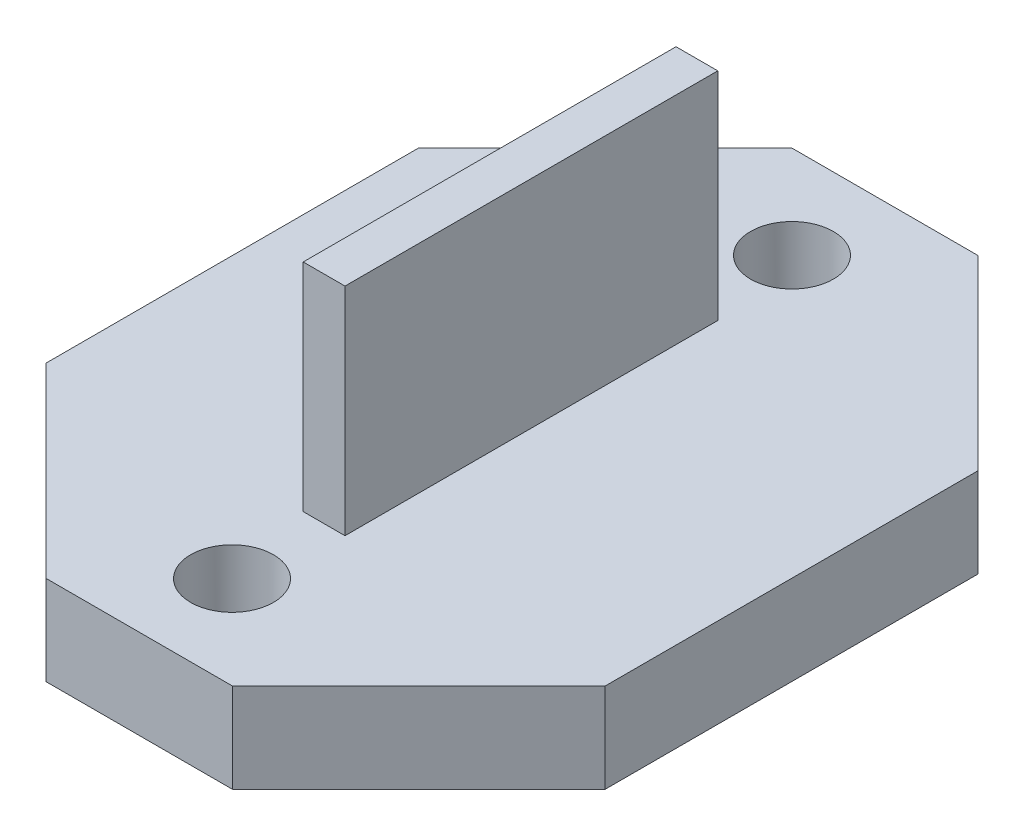
ISO-10303-21;
HEADER;
FILE_DESCRIPTION(('STEP AP214'),'2;1');
FILE_NAME('part.step','',(''),(''),'','','');
FILE_SCHEMA(('AUTOMOTIVE_DESIGN { 1 0 10303 214 1 1 1 1 }'));
ENDSEC;
DATA;
#1=APPLICATION_CONTEXT('core data for automotive mechanical design processes');
#2=APPLICATION_PROTOCOL_DEFINITION('international standard','automotive_design',2000,#1);
#3=PRODUCT_CONTEXT('',#1,'mechanical');
#4=PRODUCT('Part','Part','',(#3));
#5=PRODUCT_RELATED_PRODUCT_CATEGORY('part','',(#4));
#6=PRODUCT_DEFINITION_FORMATION('','',#4);
#7=PRODUCT_DEFINITION_CONTEXT('part definition',#1,'design');
#8=PRODUCT_DEFINITION('design','',#6,#7);
#9=PRODUCT_DEFINITION_SHAPE('','',#8);
#10=(LENGTH_UNIT() NAMED_UNIT(*) SI_UNIT(.MILLI.,.METRE.));
#11=(NAMED_UNIT(*) PLANE_ANGLE_UNIT() SI_UNIT($,.RADIAN.));
#12=(NAMED_UNIT(*) SI_UNIT($,.STERADIAN.) SOLID_ANGLE_UNIT());
#13=UNCERTAINTY_MEASURE_WITH_UNIT(LENGTH_MEASURE(1.E-05),#10,'distance_accuracy_value','');
#14=(GEOMETRIC_REPRESENTATION_CONTEXT(3) GLOBAL_UNCERTAINTY_ASSIGNED_CONTEXT((#13)) GLOBAL_UNIT_ASSIGNED_CONTEXT((#10,
#11,#12)) REPRESENTATION_CONTEXT('',''));
#15=CARTESIAN_POINT('',(0.,0.,0.));
#16=DIRECTION('',(0.,0.,1.));
#17=DIRECTION('',(1.,0.,0.));
#18=AXIS2_PLACEMENT_3D('',#15,#16,#17);
#19=CARTESIAN_POINT('',(0.,3.048,0.));
#20=DIRECTION('',(0.,-1.,0.));
#21=DIRECTION('',(0.,0.,-1.));
#22=AXIS2_PLACEMENT_3D('',#19,#20,#21);
#23=PLANE('',#22);
#24=DIRECTION('',(0.,0.,1.));
#25=VECTOR('',#24,1.);
#26=CARTESIAN_POINT('',(0.,3.048,12.7));
#27=LINE('',#26,#25);
#28=CARTESIAN_POINT('',(0.,3.048,0.));
#29=VERTEX_POINT('',#28);
#30=CARTESIAN_POINT('',(0.,3.048,12.7));
#31=VERTEX_POINT('',#30);
#32=EDGE_CURVE('E145',#29,#31,#27,.T.);
#33=ORIENTED_EDGE('',*,*,#32,.T.);
#34=DIRECTION('',(0.707106810614209,0.,0.707106751758885));
#35=VECTOR('',#34,1.);
#36=CARTESIAN_POINT('',(6.35,3.048,19.0499994714641));
#37=LINE('',#36,#35);
#38=CARTESIAN_POINT('',(6.35,3.048,19.0499994714641));
#39=VERTEX_POINT('',#38);
#40=EDGE_CURVE('E148',#31,#39,#37,.T.);
#41=ORIENTED_EDGE('',*,*,#40,.T.);
#42=DIRECTION('',(1.,0.,0.));
#43=VECTOR('',#42,1.);
#44=CARTESIAN_POINT('',(12.7,3.048,19.0499994714641));
#45=LINE('',#44,#43);
#46=CARTESIAN_POINT('',(12.7,3.048,19.0499994714641));
#47=VERTEX_POINT('',#46);
#48=EDGE_CURVE('E151',#39,#47,#45,.T.);
#49=ORIENTED_EDGE('',*,*,#48,.T.);
#50=DIRECTION('',(0.707106751758886,0.,-0.707106810614208));
#51=VECTOR('',#50,1.);
#52=CARTESIAN_POINT('',(19.05,3.048,12.6999989429282));
#53=LINE('',#52,#51);
#54=CARTESIAN_POINT('',(19.05,3.048,12.6999989429282));
#55=VERTEX_POINT('',#54);
#56=EDGE_CURVE('E153',#47,#55,#53,.T.);
#57=ORIENTED_EDGE('',*,*,#56,.T.);
#58=DIRECTION('',(0.,0.,-1.));
#59=VECTOR('',#58,1.);
#60=CARTESIAN_POINT('',(19.05,3.048,-1.05707180855785E-06));
#61=LINE('',#60,#59);
#62=CARTESIAN_POINT('',(19.05,3.048,-1.05707180855785E-06));
#63=VERTEX_POINT('',#62);
#64=EDGE_CURVE('E155',#55,#63,#61,.T.);
#65=ORIENTED_EDGE('',*,*,#64,.T.);
#66=DIRECTION('',(-0.707106810614211,0.,-0.707106751758883));
#67=VECTOR('',#66,1.);
#68=CARTESIAN_POINT('',(12.7,3.048,-6.35000052853592));
#69=LINE('',#68,#67);
#70=CARTESIAN_POINT('',(12.7,3.048,-6.35000052853592));
#71=VERTEX_POINT('',#70);
#72=EDGE_CURVE('E157',#63,#71,#69,.T.);
#73=ORIENTED_EDGE('',*,*,#72,.T.);
#74=DIRECTION('',(-1.,0.,0.));
#75=VECTOR('',#74,1.);
#76=CARTESIAN_POINT('',(6.35,3.048,-6.35000052853592));
#77=LINE('',#76,#75);
#78=CARTESIAN_POINT('',(6.35,3.048,-6.35000052853592));
#79=VERTEX_POINT('',#78);
#80=EDGE_CURVE('E159',#71,#79,#77,.T.);
#81=ORIENTED_EDGE('',*,*,#80,.T.);
#82=DIRECTION('',(-0.707106751758885,0.,0.707106810614209));
#83=VECTOR('',#82,1.);
#84=CARTESIAN_POINT('',(0.,3.048,0.));
#85=LINE('',#84,#83);
#86=EDGE_CURVE('E161',#79,#29,#85,.T.);
#87=ORIENTED_EDGE('',*,*,#86,.T.);
#88=EDGE_LOOP('',(#33,#41,#49,#57,#65,#73,#81,#87));
#89=FACE_BOUND('',#88,.T.);
#90=CARTESIAN_POINT('',(9.525,3.048,15.8876994714641));
#91=DIRECTION('',(0.,-1.,0.));
#92=DIRECTION('',(0.,0.,-1.));
#93=AXIS2_PLACEMENT_3D('',#90,#91,#92);
#94=CIRCLE('',#93,1.4097);
#95=CARTESIAN_POINT('',(9.525,3.048,14.4779994714641));
#96=VERTEX_POINT('',#95);
#97=EDGE_CURVE('E137',#96,#96,#94,.T.);
#98=ORIENTED_EDGE('',*,*,#97,.T.);
#99=EDGE_LOOP('',(#98));
#100=FACE_BOUND('',#99,.T.);
#101=CARTESIAN_POINT('',(9.525,3.048,-3.18770052853592));
#102=DIRECTION('',(0.,-1.,0.));
#103=DIRECTION('',(0.,0.,-1.));
#104=AXIS2_PLACEMENT_3D('',#101,#102,#103);
#105=CIRCLE('',#104,1.4097);
#106=CARTESIAN_POINT('',(9.525,3.048,-4.59740052853592));
#107=VERTEX_POINT('',#106);
#108=EDGE_CURVE('E141',#107,#107,#105,.T.);
#109=ORIENTED_EDGE('',*,*,#108,.T.);
#110=EDGE_LOOP('',(#109));
#111=FACE_BOUND('',#110,.T.);
#112=DIRECTION('',(0.,0.,1.));
#113=VECTOR('',#112,1.);
#114=CARTESIAN_POINT('',(8.763,3.048,-5.28535918156714E-07));
#115=LINE('',#114,#113);
#116=CARTESIAN_POINT('',(8.763,3.048,-5.28535918156714E-07));
#117=VERTEX_POINT('',#116);
#118=CARTESIAN_POINT('',(8.763,3.048,12.6999994714641));
#119=VERTEX_POINT('',#118);
#120=EDGE_CURVE('E126',#117,#119,#115,.T.);
#121=ORIENTED_EDGE('',*,*,#120,.F.);
#122=DIRECTION('',(-1.,0.,0.));
#123=VECTOR('',#122,1.);
#124=CARTESIAN_POINT('',(8.763,3.048,-5.28535918156714E-07));
#125=LINE('',#124,#123);
#126=CARTESIAN_POINT('',(10.1854,3.048,-5.28535918156714E-07));
#127=VERTEX_POINT('',#126);
#128=EDGE_CURVE('E123',#127,#117,#125,.T.);
#129=ORIENTED_EDGE('',*,*,#128,.F.);
#130=DIRECTION('',(0.,0.,-1.));
#131=VECTOR('',#130,1.);
#132=CARTESIAN_POINT('',(10.1854,3.048,-5.28535918156714E-07));
#133=LINE('',#132,#131);
#134=CARTESIAN_POINT('',(10.1854,3.048,12.6999994714641));
#135=VERTEX_POINT('',#134);
#136=EDGE_CURVE('E37',#135,#127,#133,.T.);
#137=ORIENTED_EDGE('',*,*,#136,.F.);
#138=DIRECTION('',(1.,0.,0.));
#139=VECTOR('',#138,1.);
#140=CARTESIAN_POINT('',(8.763,3.048,12.6999994714641));
#141=LINE('',#140,#139);
#142=EDGE_CURVE('E32',#119,#135,#141,.T.);
#143=ORIENTED_EDGE('',*,*,#142,.F.);
#144=EDGE_LOOP('',(#121,#129,#137,#143));
#145=FACE_BOUND('',#144,.T.);
#146=ADVANCED_FACE('F17',(#89,#100,#111,#145),#23,.F.);
#147=CARTESIAN_POINT('',(0.,3.048,12.7));
#148=DIRECTION('',(1.,0.,0.));
#149=DIRECTION('',(0.,0.,-1.));
#150=AXIS2_PLACEMENT_3D('',#147,#148,#149);
#151=PLANE('',#150);
#152=DIRECTION('',(0.,0.,1.));
#153=VECTOR('',#152,1.);
#154=CARTESIAN_POINT('',(0.,0.,12.7));
#155=LINE('',#154,#153);
#156=CARTESIAN_POINT('',(0.,0.,0.));
#157=VERTEX_POINT('',#156);
#158=CARTESIAN_POINT('',(0.,0.,12.7));
#159=VERTEX_POINT('',#158);
#160=EDGE_CURVE('E144',#157,#159,#155,.T.);
#161=ORIENTED_EDGE('',*,*,#160,.T.);
#162=DIRECTION('',(0.,-1.,0.));
#163=VECTOR('',#162,1.);
#164=CARTESIAN_POINT('',(0.,3.048,12.7));
#165=LINE('',#164,#163);
#166=EDGE_CURVE('E11',#31,#159,#165,.T.);
#167=ORIENTED_EDGE('',*,*,#166,.F.);
#168=ORIENTED_EDGE('',*,*,#32,.F.);
#169=DIRECTION('',(0.,-1.,0.));
#170=VECTOR('',#169,1.);
#171=CARTESIAN_POINT('',(0.,3.048,0.));
#172=LINE('',#171,#170);
#173=EDGE_CURVE('E163',#29,#157,#172,.T.);
#174=ORIENTED_EDGE('',*,*,#173,.T.);
#175=EDGE_LOOP('',(#161,#167,#168,#174));
#176=FACE_BOUND('',#175,.T.);
#177=ADVANCED_FACE('F19',(#176),#151,.F.);
#178=CARTESIAN_POINT('',(6.35,3.048,19.0499994714641));
#179=DIRECTION('',(0.707106751758885,0.,-0.707106810614209));
#180=DIRECTION('',(-0.707106810614209,0.,-0.707106751758885));
#181=AXIS2_PLACEMENT_3D('',#178,#179,#180);
#182=PLANE('',#181);
#183=DIRECTION('',(0.707106810614209,0.,0.707106751758885));
#184=VECTOR('',#183,1.);
#185=CARTESIAN_POINT('',(6.35,0.,19.0499994714641));
#186=LINE('',#185,#184);
#187=CARTESIAN_POINT('',(6.35,0.,19.0499994714641));
#188=VERTEX_POINT('',#187);
#189=EDGE_CURVE('E166',#159,#188,#186,.T.);
#190=ORIENTED_EDGE('',*,*,#189,.T.);
#191=DIRECTION('',(0.,-1.,0.));
#192=VECTOR('',#191,1.);
#193=CARTESIAN_POINT('',(6.35,3.048,19.0499994714641));
#194=LINE('',#193,#192);
#195=EDGE_CURVE('E25',#39,#188,#194,.T.);
#196=ORIENTED_EDGE('',*,*,#195,.F.);
#197=ORIENTED_EDGE('',*,*,#40,.F.);
#198=ORIENTED_EDGE('',*,*,#166,.T.);
#199=EDGE_LOOP('',(#190,#196,#197,#198));
#200=FACE_BOUND('',#199,.T.);
#201=ADVANCED_FACE('F223',(#200),#182,.F.);
#202=CARTESIAN_POINT('',(12.7,3.048,19.0499994714641));
#203=DIRECTION('',(0.,0.,-1.));
#204=DIRECTION('',(-1.,0.,0.));
#205=AXIS2_PLACEMENT_3D('',#202,#203,#204);
#206=PLANE('',#205);
#207=DIRECTION('',(1.,0.,0.));
#208=VECTOR('',#207,1.);
#209=CARTESIAN_POINT('',(12.7,0.,19.0499994714641));
#210=LINE('',#209,#208);
#211=CARTESIAN_POINT('',(12.7,0.,19.0499994714641));
#212=VERTEX_POINT('',#211);
#213=EDGE_CURVE('E168',#188,#212,#210,.T.);
#214=ORIENTED_EDGE('',*,*,#213,.T.);
#215=DIRECTION('',(0.,-1.,0.));
#216=VECTOR('',#215,1.);
#217=CARTESIAN_POINT('',(12.7,3.048,19.0499994714641));
#218=LINE('',#217,#216);
#219=EDGE_CURVE('E193',#47,#212,#218,.T.);
#220=ORIENTED_EDGE('',*,*,#219,.F.);
#221=ORIENTED_EDGE('',*,*,#48,.F.);
#222=ORIENTED_EDGE('',*,*,#195,.T.);
#223=EDGE_LOOP('',(#214,#220,#221,#222));
#224=FACE_BOUND('',#223,.T.);
#225=ADVANCED_FACE('F200',(#224),#206,.F.);
#226=CARTESIAN_POINT('',(19.05,3.048,12.6999989429282));
#227=DIRECTION('',(-0.707106810614208,0.,-0.707106751758886));
#228=DIRECTION('',(-0.707106751758886,0.,0.707106810614208));
#229=AXIS2_PLACEMENT_3D('',#226,#227,#228);
#230=PLANE('',#229);
#231=DIRECTION('',(0.707106751758886,0.,-0.707106810614208));
#232=VECTOR('',#231,1.);
#233=CARTESIAN_POINT('',(19.05,0.,12.6999989429282));
#234=LINE('',#233,#232);
#235=CARTESIAN_POINT('',(19.05,0.,12.6999989429282));
#236=VERTEX_POINT('',#235);
#237=EDGE_CURVE('E170',#212,#236,#234,.T.);
#238=ORIENTED_EDGE('',*,*,#237,.T.);
#239=DIRECTION('',(0.,-1.,0.));
#240=VECTOR('',#239,1.);
#241=CARTESIAN_POINT('',(19.05,3.048,12.6999989429282));
#242=LINE('',#241,#240);
#243=EDGE_CURVE('E190',#55,#236,#242,.T.);
#244=ORIENTED_EDGE('',*,*,#243,.F.);
#245=ORIENTED_EDGE('',*,*,#56,.F.);
#246=ORIENTED_EDGE('',*,*,#219,.T.);
#247=EDGE_LOOP('',(#238,#244,#245,#246));
#248=FACE_BOUND('',#247,.T.);
#249=ADVANCED_FACE('F211',(#248),#230,.F.);
#250=CARTESIAN_POINT('',(19.05,3.048,-1.05707180855785E-06));
#251=DIRECTION('',(-1.,0.,0.));
#252=DIRECTION('',(0.,0.,1.));
#253=AXIS2_PLACEMENT_3D('',#250,#251,#252);
#254=PLANE('',#253);
#255=DIRECTION('',(0.,0.,-1.));
#256=VECTOR('',#255,1.);
#257=CARTESIAN_POINT('',(19.05,0.,-1.05707180855785E-06));
#258=LINE('',#257,#256);
#259=CARTESIAN_POINT('',(19.05,0.,-1.05707180855785E-06));
#260=VERTEX_POINT('',#259);
#261=EDGE_CURVE('E172',#236,#260,#258,.T.);
#262=ORIENTED_EDGE('',*,*,#261,.T.);
#263=DIRECTION('',(0.,-1.,0.));
#264=VECTOR('',#263,1.);
#265=CARTESIAN_POINT('',(19.05,3.048,-1.05707180855785E-06));
#266=LINE('',#265,#264);
#267=EDGE_CURVE('E187',#63,#260,#266,.T.);
#268=ORIENTED_EDGE('',*,*,#267,.F.);
#269=ORIENTED_EDGE('',*,*,#64,.F.);
#270=ORIENTED_EDGE('',*,*,#243,.T.);
#271=EDGE_LOOP('',(#262,#268,#269,#270));
#272=FACE_BOUND('',#271,.T.);
#273=ADVANCED_FACE('F215',(#272),#254,.F.);
#274=CARTESIAN_POINT('',(12.7,3.048,-6.35000052853592));
#275=DIRECTION('',(-0.707106751758883,0.,0.70710681061421));
#276=DIRECTION('',(0.707106810614211,0.,0.707106751758883));
#277=AXIS2_PLACEMENT_3D('',#274,#275,#276);
#278=PLANE('',#277);
#279=DIRECTION('',(-0.707106810614211,0.,-0.707106751758883));
#280=VECTOR('',#279,1.);
#281=CARTESIAN_POINT('',(12.7,0.,-6.35000052853592));
#282=LINE('',#281,#280);
#283=CARTESIAN_POINT('',(12.7,0.,-6.35000052853592));
#284=VERTEX_POINT('',#283);
#285=EDGE_CURVE('E174',#260,#284,#282,.T.);
#286=ORIENTED_EDGE('',*,*,#285,.T.);
#287=DIRECTION('',(0.,-1.,0.));
#288=VECTOR('',#287,1.);
#289=CARTESIAN_POINT('',(12.7,3.048,-6.35000052853592));
#290=LINE('',#289,#288);
#291=EDGE_CURVE('E184',#71,#284,#290,.T.);
#292=ORIENTED_EDGE('',*,*,#291,.F.);
#293=ORIENTED_EDGE('',*,*,#72,.F.);
#294=ORIENTED_EDGE('',*,*,#267,.T.);
#295=EDGE_LOOP('',(#286,#292,#293,#294));
#296=FACE_BOUND('',#295,.T.);
#297=ADVANCED_FACE('F236',(#296),#278,.F.);
#298=CARTESIAN_POINT('',(6.35,3.048,-6.35000052853592));
#299=DIRECTION('',(0.,0.,1.));
#300=DIRECTION('',(1.,0.,0.));
#301=AXIS2_PLACEMENT_3D('',#298,#299,#300);
#302=PLANE('',#301);
#303=DIRECTION('',(-1.,0.,0.));
#304=VECTOR('',#303,1.);
#305=CARTESIAN_POINT('',(6.35,0.,-6.35000052853592));
#306=LINE('',#305,#304);
#307=CARTESIAN_POINT('',(6.35,0.,-6.35000052853592));
#308=VERTEX_POINT('',#307);
#309=EDGE_CURVE('E176',#284,#308,#306,.T.);
#310=ORIENTED_EDGE('',*,*,#309,.T.);
#311=DIRECTION('',(0.,-1.,0.));
#312=VECTOR('',#311,1.);
#313=CARTESIAN_POINT('',(6.35,3.048,-6.35000052853592));
#314=LINE('',#313,#312);
#315=EDGE_CURVE('E181',#79,#308,#314,.T.);
#316=ORIENTED_EDGE('',*,*,#315,.F.);
#317=ORIENTED_EDGE('',*,*,#80,.F.);
#318=ORIENTED_EDGE('',*,*,#291,.T.);
#319=EDGE_LOOP('',(#310,#316,#317,#318));
#320=FACE_BOUND('',#319,.T.);
#321=ADVANCED_FACE('F234',(#320),#302,.F.);
#322=CARTESIAN_POINT('',(0.,3.048,0.));
#323=DIRECTION('',(0.707106810614209,0.,0.707106751758884));
#324=DIRECTION('',(0.707106751758885,0.,-0.707106810614209));
#325=AXIS2_PLACEMENT_3D('',#322,#323,#324);
#326=PLANE('',#325);
#327=DIRECTION('',(-0.707106751758885,0.,0.707106810614209));
#328=VECTOR('',#327,1.);
#329=CARTESIAN_POINT('',(0.,0.,0.));
#330=LINE('',#329,#328);
#331=EDGE_CURVE('E149',#308,#157,#330,.T.);
#332=ORIENTED_EDGE('',*,*,#331,.T.);
#333=ORIENTED_EDGE('',*,*,#173,.F.);
#334=ORIENTED_EDGE('',*,*,#86,.F.);
#335=ORIENTED_EDGE('',*,*,#315,.T.);
#336=EDGE_LOOP('',(#332,#333,#334,#335));
#337=FACE_BOUND('',#336,.T.);
#338=ADVANCED_FACE('F229',(#337),#326,.F.);
#339=CARTESIAN_POINT('',(0.,0.,0.));
#340=DIRECTION('',(0.,-1.,0.));
#341=DIRECTION('',(0.,0.,-1.));
#342=AXIS2_PLACEMENT_3D('',#339,#340,#341);
#343=PLANE('',#342);
#344=CARTESIAN_POINT('',(9.525,0.,-3.18770052853592));
#345=DIRECTION('',(0.,1.,0.));
#346=DIRECTION('',(0.,0.,1.));
#347=AXIS2_PLACEMENT_3D('',#344,#345,#346);
#348=CIRCLE('',#347,1.4097);
#349=CARTESIAN_POINT('',(9.525,0.,-1.77800052853592));
#350=VERTEX_POINT('',#349);
#351=EDGE_CURVE('E130',#350,#350,#348,.T.);
#352=ORIENTED_EDGE('',*,*,#351,.T.);
#353=EDGE_LOOP('',(#352));
#354=FACE_BOUND('',#353,.T.);
#355=CARTESIAN_POINT('',(9.525,0.,15.8876994714641));
#356=DIRECTION('',(0.,1.,0.));
#357=DIRECTION('',(0.,0.,1.));
#358=AXIS2_PLACEMENT_3D('',#355,#356,#357);
#359=CIRCLE('',#358,1.4097);
#360=CARTESIAN_POINT('',(9.525,0.,17.2973994714641));
#361=VERTEX_POINT('',#360);
#362=EDGE_CURVE('E127',#361,#361,#359,.T.);
#363=ORIENTED_EDGE('',*,*,#362,.T.);
#364=EDGE_LOOP('',(#363));
#365=FACE_BOUND('',#364,.T.);
#366=ORIENTED_EDGE('',*,*,#160,.F.);
#367=ORIENTED_EDGE('',*,*,#331,.F.);
#368=ORIENTED_EDGE('',*,*,#309,.F.);
#369=ORIENTED_EDGE('',*,*,#285,.F.);
#370=ORIENTED_EDGE('',*,*,#261,.F.);
#371=ORIENTED_EDGE('',*,*,#237,.F.);
#372=ORIENTED_EDGE('',*,*,#213,.F.);
#373=ORIENTED_EDGE('',*,*,#189,.F.);
#374=EDGE_LOOP('',(#366,#367,#368,#369,#370,#371,#372,#373));
#375=FACE_BOUND('',#374,.T.);
#376=ADVANCED_FACE('F206',(#354,#365,#375),#343,.T.);
#377=CARTESIAN_POINT('',(9.525,0.,15.8876994714641));
#378=DIRECTION('',(0.,1.,0.));
#379=DIRECTION('',(0.,0.,1.));
#380=AXIS2_PLACEMENT_3D('',#377,#378,#379);
#381=CYLINDRICAL_SURFACE('',#380,1.4097);
#382=ORIENTED_EDGE('',*,*,#362,.F.);
#383=EDGE_LOOP('',(#382));
#384=FACE_BOUND('',#383,.T.);
#385=ORIENTED_EDGE('',*,*,#97,.F.);
#386=EDGE_LOOP('',(#385));
#387=FACE_BOUND('',#386,.T.);
#388=ADVANCED_FACE('F255',(#384,#387),#381,.F.);
#389=CARTESIAN_POINT('',(9.525,0.,-3.18770052853592));
#390=DIRECTION('',(0.,1.,0.));
#391=DIRECTION('',(0.,0.,1.));
#392=AXIS2_PLACEMENT_3D('',#389,#390,#391);
#393=CYLINDRICAL_SURFACE('',#392,1.4097);
#394=ORIENTED_EDGE('',*,*,#351,.F.);
#395=EDGE_LOOP('',(#394));
#396=FACE_BOUND('',#395,.T.);
#397=ORIENTED_EDGE('',*,*,#108,.F.);
#398=EDGE_LOOP('',(#397));
#399=FACE_BOUND('',#398,.T.);
#400=ADVANCED_FACE('F282',(#396,#399),#393,.F.);
#401=CARTESIAN_POINT('',(8.763,10.414,-5.28535918156714E-07));
#402=DIRECTION('',(1.,0.,0.));
#403=DIRECTION('',(0.,0.,-1.));
#404=AXIS2_PLACEMENT_3D('',#401,#402,#403);
#405=PLANE('',#404);
#406=ORIENTED_EDGE('',*,*,#120,.T.);
#407=DIRECTION('',(0.,-1.,0.));
#408=VECTOR('',#407,1.);
#409=CARTESIAN_POINT('',(8.763,10.414,12.6999994714641));
#410=LINE('',#409,#408);
#411=CARTESIAN_POINT('',(8.763,10.414,12.6999994714641));
#412=VERTEX_POINT('',#411);
#413=EDGE_CURVE('E107',#412,#119,#410,.T.);
#414=ORIENTED_EDGE('',*,*,#413,.F.);
#415=DIRECTION('',(0.,0.,1.));
#416=VECTOR('',#415,1.);
#417=CARTESIAN_POINT('',(8.763,10.414,-5.28535918156714E-07));
#418=LINE('',#417,#416);
#419=CARTESIAN_POINT('',(8.763,10.414,-5.28535918156714E-07));
#420=VERTEX_POINT('',#419);
#421=EDGE_CURVE('E114',#420,#412,#418,.T.);
#422=ORIENTED_EDGE('',*,*,#421,.F.);
#423=DIRECTION('',(0.,-1.,0.));
#424=VECTOR('',#423,1.);
#425=CARTESIAN_POINT('',(8.763,10.414,-5.28535918156714E-07));
#426=LINE('',#425,#424);
#427=EDGE_CURVE('E390',#420,#117,#426,.T.);
#428=ORIENTED_EDGE('',*,*,#427,.T.);
#429=EDGE_LOOP('',(#406,#414,#422,#428));
#430=FACE_BOUND('',#429,.T.);
#431=ADVANCED_FACE('F125',(#430),#405,.F.);
#432=CARTESIAN_POINT('',(8.763,10.414,12.6999994714641));
#433=DIRECTION('',(0.,0.,-1.));
#434=DIRECTION('',(-1.,0.,0.));
#435=AXIS2_PLACEMENT_3D('',#432,#433,#434);
#436=PLANE('',#435);
#437=ORIENTED_EDGE('',*,*,#142,.T.);
#438=DIRECTION('',(0.,-1.,0.));
#439=VECTOR('',#438,1.);
#440=CARTESIAN_POINT('',(10.1854,10.414,12.6999994714641));
#441=LINE('',#440,#439);
#442=CARTESIAN_POINT('',(10.1854,10.414,12.6999994714641));
#443=VERTEX_POINT('',#442);
#444=EDGE_CURVE('E110',#443,#135,#441,.T.);
#445=ORIENTED_EDGE('',*,*,#444,.F.);
#446=DIRECTION('',(1.,0.,0.));
#447=VECTOR('',#446,1.);
#448=CARTESIAN_POINT('',(8.763,10.414,12.6999994714641));
#449=LINE('',#448,#447);
#450=EDGE_CURVE('E103',#412,#443,#449,.T.);
#451=ORIENTED_EDGE('',*,*,#450,.F.);
#452=ORIENTED_EDGE('',*,*,#413,.T.);
#453=EDGE_LOOP('',(#437,#445,#451,#452));
#454=FACE_BOUND('',#453,.T.);
#455=ADVANCED_FACE('F105',(#454),#436,.F.);
#456=CARTESIAN_POINT('',(10.1854,10.414,-5.28535918156714E-07));
#457=DIRECTION('',(-1.,0.,0.));
#458=DIRECTION('',(0.,0.,1.));
#459=AXIS2_PLACEMENT_3D('',#456,#457,#458);
#460=PLANE('',#459);
#461=ORIENTED_EDGE('',*,*,#136,.T.);
#462=DIRECTION('',(0.,-1.,0.));
#463=VECTOR('',#462,1.);
#464=CARTESIAN_POINT('',(10.1854,10.414,-5.28535918156714E-07));
#465=LINE('',#464,#463);
#466=CARTESIAN_POINT('',(10.1854,10.414,-5.28535918156714E-07));
#467=VERTEX_POINT('',#466);
#468=EDGE_CURVE('E132',#467,#127,#465,.T.);
#469=ORIENTED_EDGE('',*,*,#468,.F.);
#470=DIRECTION('',(0.,0.,-1.));
#471=VECTOR('',#470,1.);
#472=CARTESIAN_POINT('',(10.1854,10.414,-5.28535918156714E-07));
#473=LINE('',#472,#471);
#474=EDGE_CURVE('E113',#443,#467,#473,.T.);
#475=ORIENTED_EDGE('',*,*,#474,.F.);
#476=ORIENTED_EDGE('',*,*,#444,.T.);
#477=EDGE_LOOP('',(#461,#469,#475,#476));
#478=FACE_BOUND('',#477,.T.);
#479=ADVANCED_FACE('F304',(#478),#460,.F.);
#480=CARTESIAN_POINT('',(8.763,10.414,-5.28535918156714E-07));
#481=DIRECTION('',(0.,0.,1.));
#482=DIRECTION('',(1.,0.,0.));
#483=AXIS2_PLACEMENT_3D('',#480,#481,#482);
#484=PLANE('',#483);
#485=ORIENTED_EDGE('',*,*,#128,.T.);
#486=ORIENTED_EDGE('',*,*,#427,.F.);
#487=DIRECTION('',(-1.,0.,0.));
#488=VECTOR('',#487,1.);
#489=CARTESIAN_POINT('',(8.763,10.414,-5.28535918156714E-07));
#490=LINE('',#489,#488);
#491=EDGE_CURVE('E119',#467,#420,#490,.T.);
#492=ORIENTED_EDGE('',*,*,#491,.F.);
#493=ORIENTED_EDGE('',*,*,#468,.T.);
#494=EDGE_LOOP('',(#485,#486,#492,#493));
#495=FACE_BOUND('',#494,.T.);
#496=ADVANCED_FACE('F312',(#495),#484,.F.);
#497=CARTESIAN_POINT('',(0.,10.414,0.));
#498=DIRECTION('',(0.,1.,0.));
#499=DIRECTION('',(0.,0.,1.));
#500=AXIS2_PLACEMENT_3D('',#497,#498,#499);
#501=PLANE('',#500);
#502=ORIENTED_EDGE('',*,*,#421,.T.);
#503=ORIENTED_EDGE('',*,*,#450,.T.);
#504=ORIENTED_EDGE('',*,*,#474,.T.);
#505=ORIENTED_EDGE('',*,*,#491,.T.);
#506=EDGE_LOOP('',(#502,#503,#504,#505));
#507=FACE_BOUND('',#506,.T.);
#508=ADVANCED_FACE('F117',(#507),#501,.T.);
#509=CLOSED_SHELL('',(#146,#177,#201,#225,#249,#273,#297,#321,#338,#376,#388,#400,#431,#455,
#479,#496,#508));
#510=MANIFOLD_SOLID_BREP('B1',#509);
#511=ADVANCED_BREP_SHAPE_REPRESENTATION('',(#18,#510),#14);
#512=SHAPE_DEFINITION_REPRESENTATION(#9,#511);
ENDSEC;
END-ISO-10303-21;
